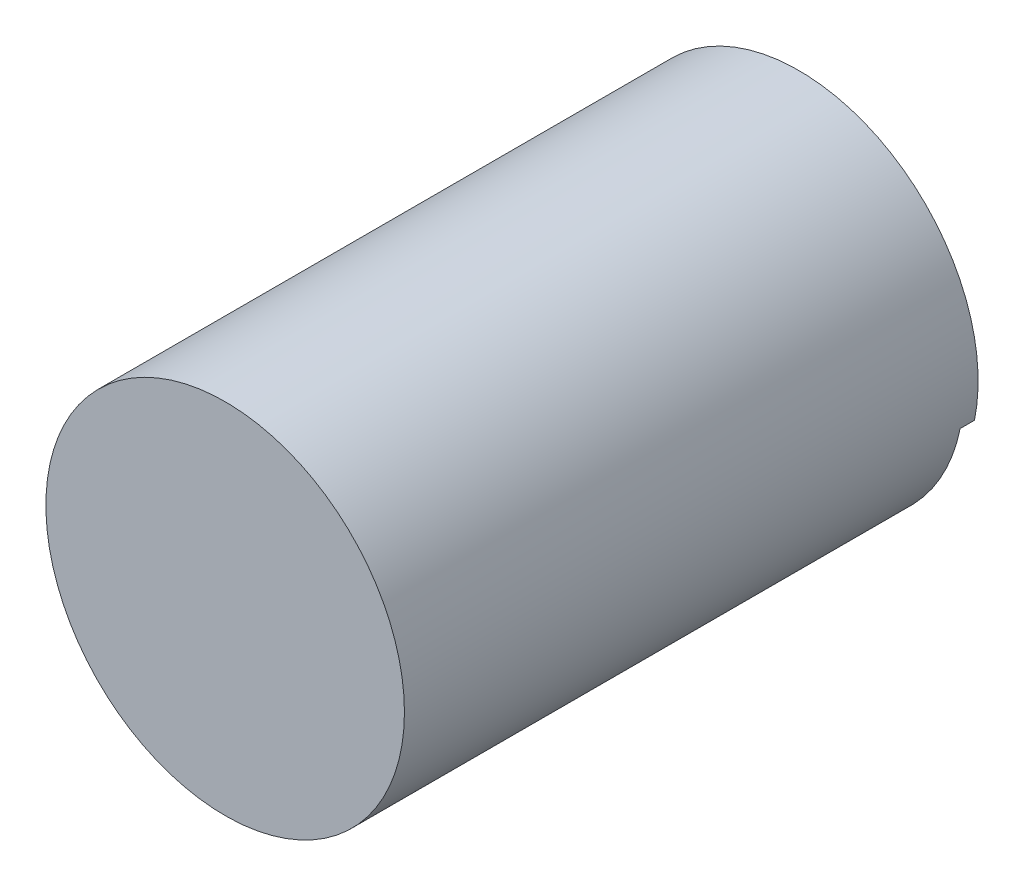
ISO-10303-21;
HEADER;
FILE_DESCRIPTION(('STEP AP214'),'2;1');
FILE_NAME('part.step','',(''),(''),'','','');
FILE_SCHEMA(('AUTOMOTIVE_DESIGN { 1 0 10303 214 1 1 1 1 }'));
ENDSEC;
DATA;
#1=APPLICATION_CONTEXT('core data for automotive mechanical design processes');
#2=APPLICATION_PROTOCOL_DEFINITION('international standard','automotive_design',2000,#1);
#3=PRODUCT_CONTEXT('',#1,'mechanical');
#4=PRODUCT('Part','Part','',(#3));
#5=PRODUCT_RELATED_PRODUCT_CATEGORY('part','',(#4));
#6=PRODUCT_DEFINITION_FORMATION('','',#4);
#7=PRODUCT_DEFINITION_CONTEXT('part definition',#1,'design');
#8=PRODUCT_DEFINITION('design','',#6,#7);
#9=PRODUCT_DEFINITION_SHAPE('','',#8);
#10=(LENGTH_UNIT() NAMED_UNIT(*) SI_UNIT(.MILLI.,.METRE.));
#11=(NAMED_UNIT(*) PLANE_ANGLE_UNIT() SI_UNIT($,.RADIAN.));
#12=(NAMED_UNIT(*) SI_UNIT($,.STERADIAN.) SOLID_ANGLE_UNIT());
#13=UNCERTAINTY_MEASURE_WITH_UNIT(LENGTH_MEASURE(1.E-05),#10,'distance_accuracy_value','');
#14=(GEOMETRIC_REPRESENTATION_CONTEXT(3) GLOBAL_UNCERTAINTY_ASSIGNED_CONTEXT((#13)) GLOBAL_UNIT_ASSIGNED_CONTEXT((#10,
#11,#12)) REPRESENTATION_CONTEXT('',''));
#15=CARTESIAN_POINT('',(0.,0.,0.));
#16=DIRECTION('',(0.,0.,1.));
#17=DIRECTION('',(1.,0.,0.));
#18=AXIS2_PLACEMENT_3D('',#15,#16,#17);
#19=CARTESIAN_POINT('',(0.,0.,80.));
#20=DIRECTION('',(0.,0.,-1.));
#21=DIRECTION('',(-1.,0.,0.));
#22=AXIS2_PLACEMENT_3D('',#19,#20,#21);
#23=CYLINDRICAL_SURFACE('',#22,25.);
#24=CARTESIAN_POINT('',(0.,0.,0.));
#25=DIRECTION('',(0.,0.,1.));
#26=DIRECTION('',(1.,0.,0.));
#27=AXIS2_PLACEMENT_3D('',#24,#25,#26);
#28=CIRCLE('',#27,25.);
#29=CARTESIAN_POINT('',(24.4948974278318,-5.,0.));
#30=VERTEX_POINT('',#29);
#31=CARTESIAN_POINT('',(-21.650635094611,-12.4999999999999,0.));
#32=VERTEX_POINT('',#31);
#33=EDGE_CURVE('E42',#30,#32,#28,.T.);
#34=ORIENTED_EDGE('',*,*,#33,.T.);
#35=DIRECTION('',(0.,0.,-1.));
#36=VECTOR('',#35,1.);
#37=CARTESIAN_POINT('',(-21.650635094611,-12.4999999999999,2.));
#38=LINE('',#37,#36);
#39=CARTESIAN_POINT('',(-21.650635094611,-12.4999999999999,2.));
#40=VERTEX_POINT('',#39);
#41=EDGE_CURVE('E92',#40,#32,#38,.T.);
#42=ORIENTED_EDGE('',*,*,#41,.F.);
#43=CARTESIAN_POINT('',(0.,0.,2.));
#44=DIRECTION('',(0.,0.,-1.));
#45=DIRECTION('',(-1.,0.,0.));
#46=AXIS2_PLACEMENT_3D('',#43,#44,#45);
#47=CIRCLE('',#46,25.);
#48=CARTESIAN_POINT('',(24.4948974278318,-5.,2.));
#49=VERTEX_POINT('',#48);
#50=EDGE_CURVE('E97',#49,#40,#47,.T.);
#51=ORIENTED_EDGE('',*,*,#50,.F.);
#52=DIRECTION('',(0.,0.,-1.));
#53=VECTOR('',#52,1.);
#54=CARTESIAN_POINT('',(24.4948974278318,-5.,2.));
#55=LINE('',#54,#53);
#56=EDGE_CURVE('E81',#49,#30,#55,.T.);
#57=ORIENTED_EDGE('',*,*,#56,.T.);
#58=EDGE_LOOP('',(#34,#42,#51,#57));
#59=FACE_BOUND('',#58,.T.);
#60=CARTESIAN_POINT('',(0.,0.,80.));
#61=DIRECTION('',(0.,0.,1.));
#62=DIRECTION('',(1.,0.,0.));
#63=AXIS2_PLACEMENT_3D('',#60,#61,#62);
#64=CIRCLE('',#63,25.);
#65=CARTESIAN_POINT('',(25.,0.,80.));
#66=VERTEX_POINT('',#65);
#67=EDGE_CURVE('E11',#66,#66,#64,.T.);
#68=ORIENTED_EDGE('',*,*,#67,.F.);
#69=EDGE_LOOP('',(#68));
#70=FACE_BOUND('',#69,.T.);
#71=ADVANCED_FACE('F39',(#59,#70),#23,.T.);
#72=CARTESIAN_POINT('',(0.,0.,80.));
#73=DIRECTION('',(0.,0.,1.));
#74=DIRECTION('',(1.,0.,0.));
#75=AXIS2_PLACEMENT_3D('',#72,#73,#74);
#76=PLANE('',#75);
#77=ORIENTED_EDGE('',*,*,#67,.T.);
#78=EDGE_LOOP('',(#77));
#79=FACE_BOUND('',#78,.T.);
#80=ADVANCED_FACE('F128',(#79),#76,.T.);
#81=CARTESIAN_POINT('',(0.,0.,0.));
#82=DIRECTION('',(0.,0.,1.));
#83=DIRECTION('',(1.,0.,0.));
#84=AXIS2_PLACEMENT_3D('',#81,#82,#83);
#85=PLANE('',#84);
#86=CARTESIAN_POINT('',(0.,-5.,0.));
#87=DIRECTION('',(0.,0.,-1.));
#88=DIRECTION('',(-1.,0.,0.));
#89=AXIS2_PLACEMENT_3D('',#86,#87,#88);
#90=CIRCLE('',#89,20.);
#91=CARTESIAN_POINT('',(-19.074750082547,-11.0128120948833,0.));
#92=VERTEX_POINT('',#91);
#93=CARTESIAN_POINT('',(0.,15.,0.));
#94=VERTEX_POINT('',#93);
#95=EDGE_CURVE('E53',#92,#94,#90,.T.);
#96=ORIENTED_EDGE('',*,*,#95,.F.);
#97=DIRECTION('',(0.86602540378444,0.499999999999998,0.));
#98=VECTOR('',#97,1.);
#99=CARTESIAN_POINT('',(-19.074750082547,-11.0128120948833,0.));
#100=LINE('',#99,#98);
#101=EDGE_CURVE('E109',#32,#92,#100,.T.);
#102=ORIENTED_EDGE('',*,*,#101,.F.);
#103=ORIENTED_EDGE('',*,*,#33,.F.);
#104=CARTESIAN_POINT('',(0.,-10.,0.));
#105=DIRECTION('',(0.,0.,-1.));
#106=DIRECTION('',(-1.,0.,0.));
#107=AXIS2_PLACEMENT_3D('',#104,#105,#106);
#108=CIRCLE('',#107,25.);
#109=EDGE_CURVE('E87',#94,#30,#108,.T.);
#110=ORIENTED_EDGE('',*,*,#109,.F.);
#111=EDGE_LOOP('',(#96,#102,#103,#110));
#112=FACE_BOUND('',#111,.T.);
#113=ADVANCED_FACE('F114',(#112),#85,.F.);
#114=CARTESIAN_POINT('',(0.,-5.,2.));
#115=DIRECTION('',(0.,0.,-1.));
#116=DIRECTION('',(-1.,0.,0.));
#117=AXIS2_PLACEMENT_3D('',#114,#115,#116);
#118=CYLINDRICAL_SURFACE('',#117,20.);
#119=ORIENTED_EDGE('',*,*,#95,.T.);
#120=DIRECTION('',(0.,0.,-1.));
#121=VECTOR('',#120,1.);
#122=CARTESIAN_POINT('',(0.,15.,2.));
#123=LINE('',#122,#121);
#124=CARTESIAN_POINT('',(0.,15.,2.));
#125=VERTEX_POINT('',#124);
#126=EDGE_CURVE('E76',#125,#94,#123,.T.);
#127=ORIENTED_EDGE('',*,*,#126,.F.);
#128=CARTESIAN_POINT('',(0.,-5.,2.));
#129=DIRECTION('',(0.,0.,-1.));
#130=DIRECTION('',(-1.,0.,0.));
#131=AXIS2_PLACEMENT_3D('',#128,#129,#130);
#132=CIRCLE('',#131,20.);
#133=CARTESIAN_POINT('',(-19.074750082547,-11.0128120948833,2.));
#134=VERTEX_POINT('',#133);
#135=EDGE_CURVE('E98',#134,#125,#132,.T.);
#136=ORIENTED_EDGE('',*,*,#135,.F.);
#137=DIRECTION('',(0.,0.,-1.));
#138=VECTOR('',#137,1.);
#139=CARTESIAN_POINT('',(-19.074750082547,-11.0128120948833,2.));
#140=LINE('',#139,#138);
#141=EDGE_CURVE('E61',#134,#92,#140,.T.);
#142=ORIENTED_EDGE('',*,*,#141,.T.);
#143=EDGE_LOOP('',(#119,#127,#136,#142));
#144=FACE_BOUND('',#143,.T.);
#145=ADVANCED_FACE('F118',(#144),#118,.F.);
#146=CARTESIAN_POINT('',(-19.074750082547,-11.0128120948833,2.));
#147=DIRECTION('',(-0.499999999999998,0.86602540378444,0.));
#148=DIRECTION('',(-0.86602540378444,-0.499999999999998,0.));
#149=AXIS2_PLACEMENT_3D('',#146,#147,#148);
#150=PLANE('',#149);
#151=ORIENTED_EDGE('',*,*,#101,.T.);
#152=ORIENTED_EDGE('',*,*,#141,.F.);
#153=DIRECTION('',(0.86602540378444,0.499999999999998,0.));
#154=VECTOR('',#153,1.);
#155=CARTESIAN_POINT('',(-19.074750082547,-11.0128120948833,2.));
#156=LINE('',#155,#154);
#157=EDGE_CURVE('E102',#40,#134,#156,.T.);
#158=ORIENTED_EDGE('',*,*,#157,.F.);
#159=ORIENTED_EDGE('',*,*,#41,.T.);
#160=EDGE_LOOP('',(#151,#152,#158,#159));
#161=FACE_BOUND('',#160,.T.);
#162=ADVANCED_FACE('F116',(#161),#150,.F.);
#163=CARTESIAN_POINT('',(0.,-10.,2.));
#164=DIRECTION('',(0.,0.,-1.));
#165=DIRECTION('',(-1.,0.,0.));
#166=AXIS2_PLACEMENT_3D('',#163,#164,#165);
#167=CYLINDRICAL_SURFACE('',#166,25.);
#168=ORIENTED_EDGE('',*,*,#109,.T.);
#169=ORIENTED_EDGE('',*,*,#56,.F.);
#170=CARTESIAN_POINT('',(0.,-10.,2.));
#171=DIRECTION('',(0.,0.,-1.));
#172=DIRECTION('',(-1.,0.,0.));
#173=AXIS2_PLACEMENT_3D('',#170,#171,#172);
#174=CIRCLE('',#173,25.);
#175=EDGE_CURVE('E84',#125,#49,#174,.T.);
#176=ORIENTED_EDGE('',*,*,#175,.F.);
#177=ORIENTED_EDGE('',*,*,#126,.T.);
#178=EDGE_LOOP('',(#168,#169,#176,#177));
#179=FACE_BOUND('',#178,.T.);
#180=ADVANCED_FACE('F83',(#179),#167,.F.);
#181=CARTESIAN_POINT('',(0.,-5.,2.));
#182=DIRECTION('',(0.,0.,-1.));
#183=DIRECTION('',(-1.,0.,0.));
#184=AXIS2_PLACEMENT_3D('',#181,#182,#183);
#185=PLANE('',#184);
#186=ORIENTED_EDGE('',*,*,#135,.T.);
#187=ORIENTED_EDGE('',*,*,#175,.T.);
#188=ORIENTED_EDGE('',*,*,#50,.T.);
#189=ORIENTED_EDGE('',*,*,#157,.T.);
#190=EDGE_LOOP('',(#186,#187,#188,#189));
#191=FACE_BOUND('',#190,.T.);
#192=ADVANCED_FACE('F95',(#191),#185,.T.);
#193=CLOSED_SHELL('',(#71,#80,#113,#145,#162,#180,#192));
#194=MANIFOLD_SOLID_BREP('B2',#193);
#195=ADVANCED_BREP_SHAPE_REPRESENTATION('',(#18,#194),#14);
#196=SHAPE_DEFINITION_REPRESENTATION(#9,#195);
ENDSEC;
END-ISO-10303-21;
